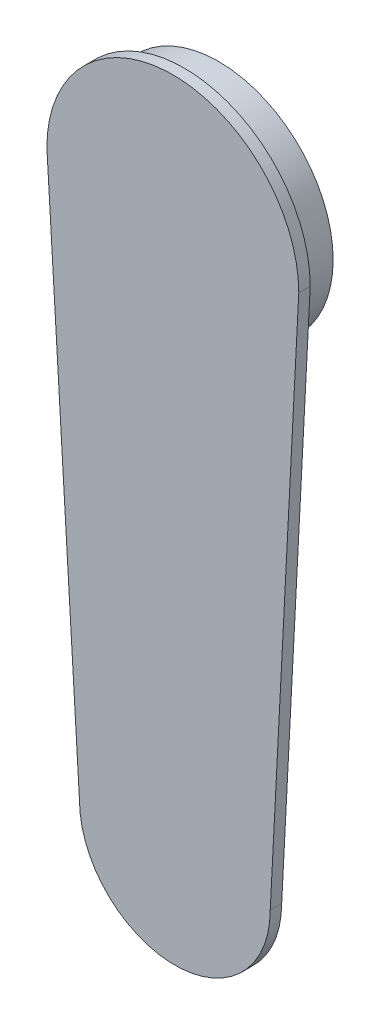
ISO-10303-21;
HEADER;
FILE_DESCRIPTION(('STEP AP214'),'2;1');
FILE_NAME('part.step','',(''),(''),'','','');
FILE_SCHEMA(('AUTOMOTIVE_DESIGN { 1 0 10303 214 1 1 1 1 }'));
ENDSEC;
DATA;
#1=APPLICATION_CONTEXT('core data for automotive mechanical design processes');
#2=APPLICATION_PROTOCOL_DEFINITION('international standard','automotive_design',2000,#1);
#3=PRODUCT_CONTEXT('',#1,'mechanical');
#4=PRODUCT('Part','Part','',(#3));
#5=PRODUCT_RELATED_PRODUCT_CATEGORY('part','',(#4));
#6=PRODUCT_DEFINITION_FORMATION('','',#4);
#7=PRODUCT_DEFINITION_CONTEXT('part definition',#1,'design');
#8=PRODUCT_DEFINITION('design','',#6,#7);
#9=PRODUCT_DEFINITION_SHAPE('','',#8);
#10=(LENGTH_UNIT() NAMED_UNIT(*) SI_UNIT(.MILLI.,.METRE.));
#11=(NAMED_UNIT(*) PLANE_ANGLE_UNIT() SI_UNIT($,.RADIAN.));
#12=(NAMED_UNIT(*) SI_UNIT($,.STERADIAN.) SOLID_ANGLE_UNIT());
#13=UNCERTAINTY_MEASURE_WITH_UNIT(LENGTH_MEASURE(1.E-05),#10,'distance_accuracy_value','');
#14=(GEOMETRIC_REPRESENTATION_CONTEXT(3) GLOBAL_UNCERTAINTY_ASSIGNED_CONTEXT((#13)) GLOBAL_UNIT_ASSIGNED_CONTEXT((#10,
#11,#12)) REPRESENTATION_CONTEXT('',''));
#15=CARTESIAN_POINT('',(0.,0.,0.));
#16=DIRECTION('',(0.,0.,1.));
#17=DIRECTION('',(1.,0.,0.));
#18=AXIS2_PLACEMENT_3D('',#15,#16,#17);
#19=CARTESIAN_POINT('',(54.8515641225065,-2.8534084972915,-0.0001));
#20=DIRECTION('',(0.998649671237995,-0.0519503044865522,0.));
#21=DIRECTION('',(0.0519503044865522,0.998649671237995,0.));
#22=AXIS2_PLACEMENT_3D('',#19,#20,#21);
#23=PLANE('',#22);
#24=DIRECTION('',(0.,0.,1.));
#25=VECTOR('',#24,1.);
#26=CARTESIAN_POINT('',(55.,0.,-0.0001));
#27=LINE('',#26,#25);
#28=CARTESIAN_POINT('',(55.,0.,-0.0001));
#29=VERTEX_POINT('',#28);
#30=CARTESIAN_POINT('',(55.,0.,5.));
#31=VERTEX_POINT('',#30);
#32=EDGE_CURVE('E79',#29,#31,#27,.T.);
#33=ORIENTED_EDGE('',*,*,#32,.T.);
#34=DIRECTION('',(0.0519503044865522,0.998649671237995,0.));
#35=VECTOR('',#34,1.);
#36=CARTESIAN_POINT('',(54.8515641225065,-2.8534084972915,5.));
#37=LINE('',#36,#35);
#38=CARTESIAN_POINT('',(42.5319269232275,-239.675921097119,5.));
#39=VERTEX_POINT('',#38);
#40=EDGE_CURVE('E82',#39,#31,#37,.T.);
#41=ORIENTED_EDGE('',*,*,#40,.F.);
#42=DIRECTION('',(0.,0.,1.));
#43=VECTOR('',#42,1.);
#44=CARTESIAN_POINT('',(42.5319269232275,-239.675921097119,-0.0001));
#45=LINE('',#44,#43);
#46=CARTESIAN_POINT('',(42.5319269232275,-239.675921097119,-0.0001));
#47=VERTEX_POINT('',#46);
#48=EDGE_CURVE('E48',#47,#39,#45,.T.);
#49=ORIENTED_EDGE('',*,*,#48,.F.);
#50=DIRECTION('',(0.0519503044865522,0.998649671237995,0.));
#51=VECTOR('',#50,1.);
#52=CARTESIAN_POINT('',(54.8515641225065,-2.8534084972915,-0.0001));
#53=LINE('',#52,#51);
#54=EDGE_CURVE('E83',#47,#29,#53,.T.);
#55=ORIENTED_EDGE('',*,*,#54,.T.);
#56=EDGE_LOOP('',(#33,#41,#49,#55));
#57=FACE_BOUND('',#56,.T.);
#58=ADVANCED_FACE('F41',(#57),#23,.T.);
#59=CARTESIAN_POINT('',(0.881926923227479,-239.675921097119,-0.0001));
#60=DIRECTION('',(0.,0.,1.));
#61=DIRECTION('',(1.,0.,0.));
#62=AXIS2_PLACEMENT_3D('',#59,#60,#61);
#63=CYLINDRICAL_SURFACE('',#62,41.65);
#64=ORIENTED_EDGE('',*,*,#48,.T.);
#65=CARTESIAN_POINT('',(0.881926923227479,-239.675921097119,5.));
#66=DIRECTION('',(0.,0.,1.));
#67=DIRECTION('',(1.,0.,0.));
#68=AXIS2_PLACEMENT_3D('',#65,#66,#67);
#69=CIRCLE('',#68,41.65);
#70=CARTESIAN_POINT('',(-40.7680730767725,-239.675921097119,5.));
#71=VERTEX_POINT('',#70);
#72=EDGE_CURVE('E99',#71,#39,#69,.T.);
#73=ORIENTED_EDGE('',*,*,#72,.F.);
#74=DIRECTION('',(0.,0.,1.));
#75=VECTOR('',#74,1.);
#76=CARTESIAN_POINT('',(-40.7680730767725,-239.675921097119,-0.0001));
#77=LINE('',#76,#75);
#78=CARTESIAN_POINT('',(-40.7680730767725,-239.675921097119,-0.0001));
#79=VERTEX_POINT('',#78);
#80=EDGE_CURVE('E62',#79,#71,#77,.T.);
#81=ORIENTED_EDGE('',*,*,#80,.F.);
#82=CARTESIAN_POINT('',(0.881926923227479,-239.675921097119,-0.0001));
#83=DIRECTION('',(0.,0.,1.));
#84=DIRECTION('',(1.,0.,0.));
#85=AXIS2_PLACEMENT_3D('',#82,#83,#84);
#86=CIRCLE('',#85,41.65);
#87=EDGE_CURVE('E88',#79,#47,#86,.T.);
#88=ORIENTED_EDGE('',*,*,#87,.T.);
#89=EDGE_LOOP('',(#64,#73,#81,#88));
#90=FACE_BOUND('',#89,.T.);
#91=ADVANCED_FACE('F119',(#90),#63,.T.);
#92=CARTESIAN_POINT('',(-54.8067530386932,-3.25441830191191,-0.0001));
#93=DIRECTION('',(-0.998241663569164,-0.0592754680679025,0.));
#94=DIRECTION('',(0.0592754680679025,-0.998241663569164,0.));
#95=AXIS2_PLACEMENT_3D('',#92,#93,#94);
#96=PLANE('',#95);
#97=ORIENTED_EDGE('',*,*,#80,.T.);
#98=DIRECTION('',(0.0592754680679025,-0.998241663569164,0.));
#99=VECTOR('',#98,1.);
#100=CARTESIAN_POINT('',(-54.8067530386932,-3.25441830191191,5.));
#101=LINE('',#100,#99);
#102=CARTESIAN_POINT('',(-55.,0.,5.));
#103=VERTEX_POINT('',#102);
#104=EDGE_CURVE('E95',#103,#71,#101,.T.);
#105=ORIENTED_EDGE('',*,*,#104,.F.);
#106=DIRECTION('',(0.,0.,1.));
#107=VECTOR('',#106,1.);
#108=CARTESIAN_POINT('',(-55.,0.,-0.0001));
#109=LINE('',#108,#107);
#110=CARTESIAN_POINT('',(-55.,0.,-0.0001));
#111=VERTEX_POINT('',#110);
#112=EDGE_CURVE('E87',#111,#103,#109,.T.);
#113=ORIENTED_EDGE('',*,*,#112,.F.);
#114=DIRECTION('',(0.0592754680679025,-0.998241663569164,0.));
#115=VECTOR('',#114,1.);
#116=CARTESIAN_POINT('',(-54.8067530386932,-3.25441830191191,-0.0001));
#117=LINE('',#116,#115);
#118=EDGE_CURVE('E110',#111,#79,#117,.T.);
#119=ORIENTED_EDGE('',*,*,#118,.T.);
#120=EDGE_LOOP('',(#97,#105,#113,#119));
#121=FACE_BOUND('',#120,.T.);
#122=ADVANCED_FACE('F116',(#121),#96,.T.);
#123=CARTESIAN_POINT('',(0.,0.,-0.0001));
#124=DIRECTION('',(0.,0.,1.));
#125=DIRECTION('',(1.,0.,0.));
#126=AXIS2_PLACEMENT_3D('',#123,#124,#125);
#127=CYLINDRICAL_SURFACE('',#126,55.);
#128=ORIENTED_EDGE('',*,*,#112,.T.);
#129=CARTESIAN_POINT('',(0.,0.,5.));
#130=DIRECTION('',(0.,0.,1.));
#131=DIRECTION('',(1.,0.,0.));
#132=AXIS2_PLACEMENT_3D('',#129,#130,#131);
#133=CIRCLE('',#132,55.);
#134=EDGE_CURVE('E90',#31,#103,#133,.T.);
#135=ORIENTED_EDGE('',*,*,#134,.F.);
#136=ORIENTED_EDGE('',*,*,#32,.F.);
#137=CARTESIAN_POINT('',(0.,0.,-0.0001));
#138=DIRECTION('',(0.,0.,1.));
#139=DIRECTION('',(1.,0.,0.));
#140=AXIS2_PLACEMENT_3D('',#137,#138,#139);
#141=CIRCLE('',#140,55.);
#142=EDGE_CURVE('E108',#29,#111,#141,.T.);
#143=ORIENTED_EDGE('',*,*,#142,.T.);
#144=EDGE_LOOP('',(#128,#135,#136,#143));
#145=FACE_BOUND('',#144,.T.);
#146=ADVANCED_FACE('F91',(#145),#127,.T.);
#147=CARTESIAN_POINT('',(0.,0.,-0.0001));
#148=DIRECTION('',(0.,0.,1.));
#149=DIRECTION('',(1.,0.,0.));
#150=AXIS2_PLACEMENT_3D('',#147,#148,#149);
#151=PLANE('',#150);
#152=CARTESIAN_POINT('',(0.,0.,-9.99999999994061E-05));
#153=DIRECTION('',(0.,0.,1.));
#154=DIRECTION('',(1.,0.,0.));
#155=AXIS2_PLACEMENT_3D('',#152,#153,#154);
#156=CIRCLE('',#155,50.);
#157=CARTESIAN_POINT('',(50.,0.,-9.99999999994061E-05));
#158=VERTEX_POINT('',#157);
#159=EDGE_CURVE('E11',#158,#158,#156,.F.);
#160=ORIENTED_EDGE('',*,*,#159,.F.);
#161=EDGE_LOOP('',(#160));
#162=FACE_BOUND('',#161,.T.);
#163=ORIENTED_EDGE('',*,*,#54,.F.);
#164=ORIENTED_EDGE('',*,*,#87,.F.);
#165=ORIENTED_EDGE('',*,*,#118,.F.);
#166=ORIENTED_EDGE('',*,*,#142,.F.);
#167=EDGE_LOOP('',(#163,#164,#165,#166));
#168=FACE_BOUND('',#167,.T.);
#169=ADVANCED_FACE('F121',(#162,#168),#151,.F.);
#170=CARTESIAN_POINT('',(0.,0.,5.));
#171=DIRECTION('',(0.,0.,1.));
#172=DIRECTION('',(1.,0.,0.));
#173=AXIS2_PLACEMENT_3D('',#170,#171,#172);
#174=PLANE('',#173);
#175=ORIENTED_EDGE('',*,*,#40,.T.);
#176=ORIENTED_EDGE('',*,*,#134,.T.);
#177=ORIENTED_EDGE('',*,*,#104,.T.);
#178=ORIENTED_EDGE('',*,*,#72,.T.);
#179=EDGE_LOOP('',(#175,#176,#177,#178));
#180=FACE_BOUND('',#179,.T.);
#181=ADVANCED_FACE('F98',(#180),#174,.T.);
#182=CARTESIAN_POINT('',(0.,0.,-15.0001));
#183=DIRECTION('',(0.,0.,1.));
#184=DIRECTION('',(1.,0.,0.));
#185=AXIS2_PLACEMENT_3D('',#182,#183,#184);
#186=CYLINDRICAL_SURFACE('',#185,50.);
#187=CARTESIAN_POINT('',(0.,0.,-15.0001));
#188=DIRECTION('',(0.,0.,-1.));
#189=DIRECTION('',(-1.,0.,0.));
#190=AXIS2_PLACEMENT_3D('',#187,#188,#189);
#191=CIRCLE('',#190,50.);
#192=CARTESIAN_POINT('',(-50.,0.,-15.0001));
#193=VERTEX_POINT('',#192);
#194=EDGE_CURVE('E100',#193,#193,#191,.T.);
#195=ORIENTED_EDGE('',*,*,#194,.F.);
#196=EDGE_LOOP('',(#195));
#197=FACE_BOUND('',#196,.T.);
#198=ORIENTED_EDGE('',*,*,#159,.T.);
#199=EDGE_LOOP('',(#198));
#200=FACE_BOUND('',#199,.T.);
#201=ADVANCED_FACE('F129',(#197,#200),#186,.T.);
#202=CARTESIAN_POINT('',(0.,0.,-15.0001));
#203=DIRECTION('',(0.,0.,-1.));
#204=DIRECTION('',(-1.,0.,0.));
#205=AXIS2_PLACEMENT_3D('',#202,#203,#204);
#206=PLANE('',#205);
#207=ORIENTED_EDGE('',*,*,#194,.T.);
#208=EDGE_LOOP('',(#207));
#209=FACE_BOUND('',#208,.T.);
#210=ADVANCED_FACE('F171',(#209),#206,.T.);
#211=CLOSED_SHELL('',(#58,#91,#122,#146,#169,#181,#201,#210));
#212=MANIFOLD_SOLID_BREP('B2',#211);
#213=ADVANCED_BREP_SHAPE_REPRESENTATION('',(#18,#212),#14);
#214=SHAPE_DEFINITION_REPRESENTATION(#9,#213);
ENDSEC;
END-ISO-10303-21;
